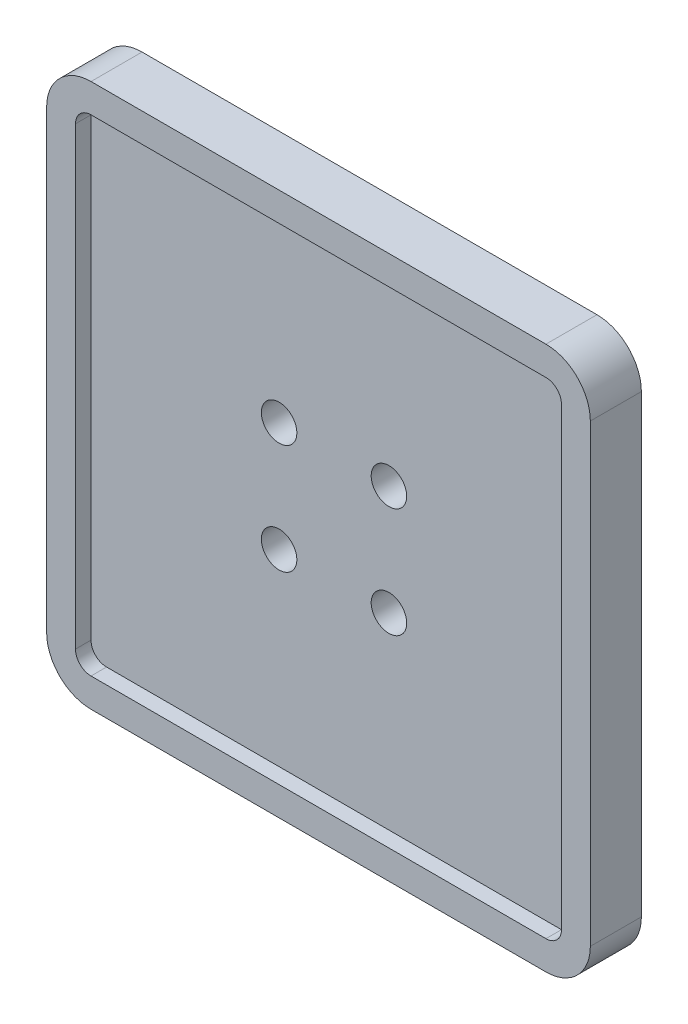
ISO-10303-21;
HEADER;
FILE_DESCRIPTION(('STEP AP214'),'2;1');
FILE_NAME('part.step','',(''),(''),'','','');
FILE_SCHEMA(('AUTOMOTIVE_DESIGN { 1 0 10303 214 1 1 1 1 }'));
ENDSEC;
DATA;
#1=APPLICATION_CONTEXT('core data for automotive mechanical design processes');
#2=APPLICATION_PROTOCOL_DEFINITION('international standard','automotive_design',2000,#1);
#3=PRODUCT_CONTEXT('',#1,'mechanical');
#4=PRODUCT('Part','Part','',(#3));
#5=PRODUCT_RELATED_PRODUCT_CATEGORY('part','',(#4));
#6=PRODUCT_DEFINITION_FORMATION('','',#4);
#7=PRODUCT_DEFINITION_CONTEXT('part definition',#1,'design');
#8=PRODUCT_DEFINITION('design','',#6,#7);
#9=PRODUCT_DEFINITION_SHAPE('','',#8);
#10=(LENGTH_UNIT() NAMED_UNIT(*) SI_UNIT(.MILLI.,.METRE.));
#11=(NAMED_UNIT(*) PLANE_ANGLE_UNIT() SI_UNIT($,.RADIAN.));
#12=(NAMED_UNIT(*) SI_UNIT($,.STERADIAN.) SOLID_ANGLE_UNIT());
#13=UNCERTAINTY_MEASURE_WITH_UNIT(LENGTH_MEASURE(1.E-05),#10,'distance_accuracy_value','');
#14=(GEOMETRIC_REPRESENTATION_CONTEXT(3) GLOBAL_UNCERTAINTY_ASSIGNED_CONTEXT((#13)) GLOBAL_UNIT_ASSIGNED_CONTEXT((#10,
#11,#12)) REPRESENTATION_CONTEXT('',''));
#15=CARTESIAN_POINT('',(0.,0.,0.));
#16=DIRECTION('',(0.,0.,1.));
#17=DIRECTION('',(1.,0.,0.));
#18=AXIS2_PLACEMENT_3D('',#15,#16,#17);
#19=CARTESIAN_POINT('',(-4.94974746830583,4.94974746830583,4.6));
#20=DIRECTION('',(0.,0.,-1.));
#21=DIRECTION('',(-1.,0.,0.));
#22=AXIS2_PLACEMENT_3D('',#19,#20,#21);
#23=CYLINDRICAL_SURFACE('',#22,1.6);
#24=CARTESIAN_POINT('',(-4.94974746830583,4.94974746830583,0.));
#25=DIRECTION('',(0.,0.,1.));
#26=DIRECTION('',(1.,0.,0.));
#27=AXIS2_PLACEMENT_3D('',#24,#25,#26);
#28=CIRCLE('',#27,1.6);
#29=CARTESIAN_POINT('',(-3.34974746830583,4.94974746830583,0.));
#30=VERTEX_POINT('',#29);
#31=EDGE_CURVE('E147',#30,#30,#28,.T.);
#32=ORIENTED_EDGE('',*,*,#31,.F.);
#33=EDGE_LOOP('',(#32));
#34=FACE_BOUND('',#33,.T.);
#35=CARTESIAN_POINT('',(-4.94974746830583,4.94974746830583,3.2));
#36=DIRECTION('',(0.,0.,1.));
#37=DIRECTION('',(1.,0.,0.));
#38=AXIS2_PLACEMENT_3D('',#35,#36,#37);
#39=CIRCLE('',#38,1.6);
#40=CARTESIAN_POINT('',(-3.34974746830583,4.94974746830583,3.2));
#41=VERTEX_POINT('',#40);
#42=EDGE_CURVE('E205',#41,#41,#39,.T.);
#43=ORIENTED_EDGE('',*,*,#42,.T.);
#44=EDGE_LOOP('',(#43));
#45=FACE_BOUND('',#44,.T.);
#46=ADVANCED_FACE('F33',(#34,#45),#23,.F.);
#47=CARTESIAN_POINT('',(4.94974746830583,4.94974746830583,4.6));
#48=DIRECTION('',(0.,0.,-1.));
#49=DIRECTION('',(-1.,0.,0.));
#50=AXIS2_PLACEMENT_3D('',#47,#48,#49);
#51=CYLINDRICAL_SURFACE('',#50,1.6);
#52=CARTESIAN_POINT('',(4.94974746830583,4.94974746830583,0.));
#53=DIRECTION('',(0.,0.,1.));
#54=DIRECTION('',(1.,0.,0.));
#55=AXIS2_PLACEMENT_3D('',#52,#53,#54);
#56=CIRCLE('',#55,1.6);
#57=CARTESIAN_POINT('',(6.54974746830583,4.94974746830583,0.));
#58=VERTEX_POINT('',#57);
#59=EDGE_CURVE('E196',#58,#58,#56,.T.);
#60=ORIENTED_EDGE('',*,*,#59,.F.);
#61=EDGE_LOOP('',(#60));
#62=FACE_BOUND('',#61,.T.);
#63=CARTESIAN_POINT('',(4.94974746830583,4.94974746830583,3.2));
#64=DIRECTION('',(0.,0.,1.));
#65=DIRECTION('',(1.,0.,0.));
#66=AXIS2_PLACEMENT_3D('',#63,#64,#65);
#67=CIRCLE('',#66,1.6);
#68=CARTESIAN_POINT('',(6.54974746830583,4.94974746830583,3.2));
#69=VERTEX_POINT('',#68);
#70=EDGE_CURVE('E208',#69,#69,#67,.T.);
#71=ORIENTED_EDGE('',*,*,#70,.T.);
#72=EDGE_LOOP('',(#71));
#73=FACE_BOUND('',#72,.T.);
#74=ADVANCED_FACE('F356',(#62,#73),#51,.F.);
#75=CARTESIAN_POINT('',(4.94974746830583,-4.94974746830583,4.6));
#76=DIRECTION('',(0.,0.,-1.));
#77=DIRECTION('',(-1.,0.,0.));
#78=AXIS2_PLACEMENT_3D('',#75,#76,#77);
#79=CYLINDRICAL_SURFACE('',#78,1.6);
#80=CARTESIAN_POINT('',(4.94974746830583,-4.94974746830583,0.));
#81=DIRECTION('',(0.,0.,1.));
#82=DIRECTION('',(1.,0.,0.));
#83=AXIS2_PLACEMENT_3D('',#80,#81,#82);
#84=CIRCLE('',#83,1.6);
#85=CARTESIAN_POINT('',(6.54974746830583,-4.94974746830583,0.));
#86=VERTEX_POINT('',#85);
#87=EDGE_CURVE('E199',#86,#86,#84,.T.);
#88=ORIENTED_EDGE('',*,*,#87,.F.);
#89=EDGE_LOOP('',(#88));
#90=FACE_BOUND('',#89,.T.);
#91=CARTESIAN_POINT('',(4.94974746830583,-4.94974746830583,3.2));
#92=DIRECTION('',(0.,0.,1.));
#93=DIRECTION('',(1.,0.,0.));
#94=AXIS2_PLACEMENT_3D('',#91,#92,#93);
#95=CIRCLE('',#94,1.6);
#96=CARTESIAN_POINT('',(6.54974746830583,-4.94974746830583,3.2));
#97=VERTEX_POINT('',#96);
#98=EDGE_CURVE('E211',#97,#97,#95,.T.);
#99=ORIENTED_EDGE('',*,*,#98,.T.);
#100=EDGE_LOOP('',(#99));
#101=FACE_BOUND('',#100,.T.);
#102=ADVANCED_FACE('F362',(#90,#101),#79,.F.);
#103=CARTESIAN_POINT('',(-4.94974746830583,-4.94974746830583,4.6));
#104=DIRECTION('',(0.,0.,-1.));
#105=DIRECTION('',(-1.,0.,0.));
#106=AXIS2_PLACEMENT_3D('',#103,#104,#105);
#107=CYLINDRICAL_SURFACE('',#106,1.6);
#108=CARTESIAN_POINT('',(-4.94974746830583,-4.94974746830583,0.));
#109=DIRECTION('',(0.,0.,1.));
#110=DIRECTION('',(1.,0.,0.));
#111=AXIS2_PLACEMENT_3D('',#108,#109,#110);
#112=CIRCLE('',#111,1.6);
#113=CARTESIAN_POINT('',(-3.34974746830583,-4.94974746830583,0.));
#114=VERTEX_POINT('',#113);
#115=EDGE_CURVE('E202',#114,#114,#112,.T.);
#116=ORIENTED_EDGE('',*,*,#115,.F.);
#117=EDGE_LOOP('',(#116));
#118=FACE_BOUND('',#117,.T.);
#119=CARTESIAN_POINT('',(-4.94974746830583,-4.94974746830583,3.2));
#120=DIRECTION('',(0.,0.,1.));
#121=DIRECTION('',(1.,0.,0.));
#122=AXIS2_PLACEMENT_3D('',#119,#120,#121);
#123=CIRCLE('',#122,1.6);
#124=CARTESIAN_POINT('',(-3.34974746830583,-4.94974746830583,3.2));
#125=VERTEX_POINT('',#124);
#126=EDGE_CURVE('E37',#125,#125,#123,.T.);
#127=ORIENTED_EDGE('',*,*,#126,.T.);
#128=EDGE_LOOP('',(#127));
#129=FACE_BOUND('',#128,.T.);
#130=ADVANCED_FACE('F371',(#118,#129),#107,.F.);
#131=CARTESIAN_POINT('',(20.5,-20.5,4.6));
#132=DIRECTION('',(0.,0.,-1.));
#133=DIRECTION('',(-1.,0.,0.));
#134=AXIS2_PLACEMENT_3D('',#131,#132,#133);
#135=PLANE('',#134);
#136=DIRECTION('',(0.,1.,0.));
#137=VECTOR('',#136,1.);
#138=CARTESIAN_POINT('',(21.9,-20.5,4.6));
#139=LINE('',#138,#137);
#140=CARTESIAN_POINT('',(21.9,-20.5,4.6));
#141=VERTEX_POINT('',#140);
#142=CARTESIAN_POINT('',(21.9,20.5,4.6));
#143=VERTEX_POINT('',#142);
#144=EDGE_CURVE('E256',#141,#143,#139,.T.);
#145=ORIENTED_EDGE('',*,*,#144,.F.);
#146=CARTESIAN_POINT('',(20.5,-20.5,4.6));
#147=DIRECTION('',(0.,0.,1.));
#148=DIRECTION('',(1.,0.,0.));
#149=AXIS2_PLACEMENT_3D('',#146,#147,#148);
#150=CIRCLE('',#149,1.39999999999998);
#151=CARTESIAN_POINT('',(20.5,-21.9,4.6));
#152=VERTEX_POINT('',#151);
#153=EDGE_CURVE('E49',#152,#141,#150,.T.);
#154=ORIENTED_EDGE('',*,*,#153,.F.);
#155=DIRECTION('',(1.,0.,0.));
#156=VECTOR('',#155,1.);
#157=CARTESIAN_POINT('',(-20.5,-21.9,4.6));
#158=LINE('',#157,#156);
#159=CARTESIAN_POINT('',(-20.5,-21.9,4.6));
#160=VERTEX_POINT('',#159);
#161=EDGE_CURVE('E237',#160,#152,#158,.T.);
#162=ORIENTED_EDGE('',*,*,#161,.F.);
#163=CARTESIAN_POINT('',(-20.5,-20.5,4.6));
#164=DIRECTION('',(0.,0.,1.));
#165=DIRECTION('',(1.,0.,0.));
#166=AXIS2_PLACEMENT_3D('',#163,#164,#165);
#167=CIRCLE('',#166,1.40000000000005);
#168=CARTESIAN_POINT('',(-21.9,-20.5,4.6));
#169=VERTEX_POINT('',#168);
#170=EDGE_CURVE('E241',#169,#160,#167,.T.);
#171=ORIENTED_EDGE('',*,*,#170,.F.);
#172=DIRECTION('',(0.,-1.,0.));
#173=VECTOR('',#172,1.);
#174=CARTESIAN_POINT('',(-21.9,20.5,4.6));
#175=LINE('',#174,#173);
#176=CARTESIAN_POINT('',(-21.9,20.5,4.6));
#177=VERTEX_POINT('',#176);
#178=EDGE_CURVE('E244',#177,#169,#175,.T.);
#179=ORIENTED_EDGE('',*,*,#178,.F.);
#180=CARTESIAN_POINT('',(-20.5,20.5,4.6));
#181=DIRECTION('',(0.,0.,1.));
#182=DIRECTION('',(1.,0.,0.));
#183=AXIS2_PLACEMENT_3D('',#180,#181,#182);
#184=CIRCLE('',#183,1.4);
#185=CARTESIAN_POINT('',(-20.5,21.9,4.6));
#186=VERTEX_POINT('',#185);
#187=EDGE_CURVE('E247',#186,#177,#184,.T.);
#188=ORIENTED_EDGE('',*,*,#187,.F.);
#189=DIRECTION('',(-1.,0.,0.));
#190=VECTOR('',#189,1.);
#191=CARTESIAN_POINT('',(20.5,21.9,4.6));
#192=LINE('',#191,#190);
#193=CARTESIAN_POINT('',(20.5,21.9,4.6));
#194=VERTEX_POINT('',#193);
#195=EDGE_CURVE('E250',#194,#186,#192,.T.);
#196=ORIENTED_EDGE('',*,*,#195,.F.);
#197=CARTESIAN_POINT('',(20.5,20.5,4.6));
#198=DIRECTION('',(0.,0.,1.));
#199=DIRECTION('',(1.,0.,0.));
#200=AXIS2_PLACEMENT_3D('',#197,#198,#199);
#201=CIRCLE('',#200,1.40000000000004);
#202=EDGE_CURVE('E253',#143,#194,#201,.T.);
#203=ORIENTED_EDGE('',*,*,#202,.F.);
#204=EDGE_LOOP('',(#145,#154,#162,#171,#179,#188,#196,#203));
#205=FACE_BOUND('',#204,.T.);
#206=CARTESIAN_POINT('',(20.5,-20.5,4.6));
#207=DIRECTION('',(0.,0.,1.));
#208=DIRECTION('',(-1.,0.,0.));
#209=AXIS2_PLACEMENT_3D('',#206,#207,#208);
#210=CIRCLE('',#209,3.99999999999998);
#211=CARTESIAN_POINT('',(20.5,-24.5,4.6));
#212=VERTEX_POINT('',#211);
#213=CARTESIAN_POINT('',(24.5,-20.5,4.6));
#214=VERTEX_POINT('',#213);
#215=EDGE_CURVE('E159',#212,#214,#210,.T.);
#216=ORIENTED_EDGE('',*,*,#215,.T.);
#217=DIRECTION('',(0.,1.,0.));
#218=VECTOR('',#217,1.);
#219=CARTESIAN_POINT('',(24.5,20.5,4.6));
#220=LINE('',#219,#218);
#221=CARTESIAN_POINT('',(24.5,20.5,4.6));
#222=VERTEX_POINT('',#221);
#223=EDGE_CURVE('E99',#214,#222,#220,.T.);
#224=ORIENTED_EDGE('',*,*,#223,.T.);
#225=CARTESIAN_POINT('',(20.5,20.5,4.6));
#226=DIRECTION('',(0.,0.,1.));
#227=DIRECTION('',(-1.,0.,0.));
#228=AXIS2_PLACEMENT_3D('',#225,#226,#227);
#229=CIRCLE('',#228,4.00000000000004);
#230=CARTESIAN_POINT('',(20.5,24.5,4.6));
#231=VERTEX_POINT('',#230);
#232=EDGE_CURVE('E175',#222,#231,#229,.T.);
#233=ORIENTED_EDGE('',*,*,#232,.T.);
#234=DIRECTION('',(-1.,0.,0.));
#235=VECTOR('',#234,1.);
#236=CARTESIAN_POINT('',(-20.5,24.5,4.6));
#237=LINE('',#236,#235);
#238=CARTESIAN_POINT('',(-20.5,24.5,4.6));
#239=VERTEX_POINT('',#238);
#240=EDGE_CURVE('E188',#231,#239,#237,.T.);
#241=ORIENTED_EDGE('',*,*,#240,.T.);
#242=CARTESIAN_POINT('',(-20.5,20.5,4.6));
#243=DIRECTION('',(0.,0.,1.));
#244=DIRECTION('',(-1.,0.,0.));
#245=AXIS2_PLACEMENT_3D('',#242,#243,#244);
#246=CIRCLE('',#245,4.);
#247=CARTESIAN_POINT('',(-24.5,20.5,4.6));
#248=VERTEX_POINT('',#247);
#249=EDGE_CURVE('E122',#239,#248,#246,.T.);
#250=ORIENTED_EDGE('',*,*,#249,.T.);
#251=DIRECTION('',(0.,-1.,0.));
#252=VECTOR('',#251,1.);
#253=CARTESIAN_POINT('',(-24.5,-20.5,4.6));
#254=LINE('',#253,#252);
#255=CARTESIAN_POINT('',(-24.5,-20.5,4.6));
#256=VERTEX_POINT('',#255);
#257=EDGE_CURVE('E115',#248,#256,#254,.T.);
#258=ORIENTED_EDGE('',*,*,#257,.T.);
#259=CARTESIAN_POINT('',(-20.5,-20.5,4.6));
#260=DIRECTION('',(0.,0.,1.));
#261=DIRECTION('',(1.,0.,0.));
#262=AXIS2_PLACEMENT_3D('',#259,#260,#261);
#263=CIRCLE('',#262,4.00000000000005);
#264=CARTESIAN_POINT('',(-20.5,-24.5,4.6));
#265=VERTEX_POINT('',#264);
#266=EDGE_CURVE('E119',#256,#265,#263,.T.);
#267=ORIENTED_EDGE('',*,*,#266,.T.);
#268=DIRECTION('',(1.,0.,0.));
#269=VECTOR('',#268,1.);
#270=CARTESIAN_POINT('',(20.5,-24.5,4.6));
#271=LINE('',#270,#269);
#272=EDGE_CURVE('E58',#265,#212,#271,.T.);
#273=ORIENTED_EDGE('',*,*,#272,.T.);
#274=EDGE_LOOP('',(#216,#224,#233,#241,#250,#258,#267,#273));
#275=FACE_BOUND('',#274,.T.);
#276=ADVANCED_FACE('F117',(#205,#275),#135,.F.);
#277=CARTESIAN_POINT('',(20.5,-20.5,0.));
#278=DIRECTION('',(0.,0.,-1.));
#279=DIRECTION('',(-1.,0.,0.));
#280=AXIS2_PLACEMENT_3D('',#277,#278,#279);
#281=PLANE('',#280);
#282=ORIENTED_EDGE('',*,*,#87,.T.);
#283=EDGE_LOOP('',(#282));
#284=FACE_BOUND('',#283,.T.);
#285=ORIENTED_EDGE('',*,*,#31,.T.);
#286=EDGE_LOOP('',(#285));
#287=FACE_BOUND('',#286,.T.);
#288=CARTESIAN_POINT('',(20.5,-20.5,0.));
#289=DIRECTION('',(0.,0.,1.));
#290=DIRECTION('',(-1.,0.,0.));
#291=AXIS2_PLACEMENT_3D('',#288,#289,#290);
#292=CIRCLE('',#291,3.99999999999998);
#293=CARTESIAN_POINT('',(20.5,-24.5,0.));
#294=VERTEX_POINT('',#293);
#295=CARTESIAN_POINT('',(24.5,-20.5,0.));
#296=VERTEX_POINT('',#295);
#297=EDGE_CURVE('E143',#294,#296,#292,.T.);
#298=ORIENTED_EDGE('',*,*,#297,.F.);
#299=DIRECTION('',(1.,0.,0.));
#300=VECTOR('',#299,1.);
#301=CARTESIAN_POINT('',(20.5,-24.5,0.));
#302=LINE('',#301,#300);
#303=CARTESIAN_POINT('',(-20.5,-24.5,0.));
#304=VERTEX_POINT('',#303);
#305=EDGE_CURVE('E91',#304,#294,#302,.T.);
#306=ORIENTED_EDGE('',*,*,#305,.F.);
#307=CARTESIAN_POINT('',(-20.5,-20.5,0.));
#308=DIRECTION('',(0.,0.,1.));
#309=DIRECTION('',(1.,0.,0.));
#310=AXIS2_PLACEMENT_3D('',#307,#308,#309);
#311=CIRCLE('',#310,4.00000000000005);
#312=CARTESIAN_POINT('',(-24.5,-20.5,0.));
#313=VERTEX_POINT('',#312);
#314=EDGE_CURVE('E156',#313,#304,#311,.T.);
#315=ORIENTED_EDGE('',*,*,#314,.F.);
#316=DIRECTION('',(0.,-1.,0.));
#317=VECTOR('',#316,1.);
#318=CARTESIAN_POINT('',(-24.5,-20.5,0.));
#319=LINE('',#318,#317);
#320=CARTESIAN_POINT('',(-24.5,20.5,0.));
#321=VERTEX_POINT('',#320);
#322=EDGE_CURVE('E131',#321,#313,#319,.T.);
#323=ORIENTED_EDGE('',*,*,#322,.F.);
#324=CARTESIAN_POINT('',(-20.5,20.5,0.));
#325=DIRECTION('',(0.,0.,1.));
#326=DIRECTION('',(-1.,0.,0.));
#327=AXIS2_PLACEMENT_3D('',#324,#325,#326);
#328=CIRCLE('',#327,4.);
#329=CARTESIAN_POINT('',(-20.5,24.5,0.));
#330=VERTEX_POINT('',#329);
#331=EDGE_CURVE('E153',#330,#321,#328,.T.);
#332=ORIENTED_EDGE('',*,*,#331,.F.);
#333=DIRECTION('',(-1.,0.,0.));
#334=VECTOR('',#333,1.);
#335=CARTESIAN_POINT('',(-20.5,24.5,0.));
#336=LINE('',#335,#334);
#337=CARTESIAN_POINT('',(20.5,24.5,0.));
#338=VERTEX_POINT('',#337);
#339=EDGE_CURVE('E151',#338,#330,#336,.T.);
#340=ORIENTED_EDGE('',*,*,#339,.F.);
#341=CARTESIAN_POINT('',(20.5,20.5,0.));
#342=DIRECTION('',(0.,0.,1.));
#343=DIRECTION('',(-1.,0.,0.));
#344=AXIS2_PLACEMENT_3D('',#341,#342,#343);
#345=CIRCLE('',#344,4.00000000000004);
#346=CARTESIAN_POINT('',(24.5,20.5,0.));
#347=VERTEX_POINT('',#346);
#348=EDGE_CURVE('E149',#347,#338,#345,.T.);
#349=ORIENTED_EDGE('',*,*,#348,.F.);
#350=DIRECTION('',(0.,1.,0.));
#351=VECTOR('',#350,1.);
#352=CARTESIAN_POINT('',(24.5,20.5,0.));
#353=LINE('',#352,#351);
#354=EDGE_CURVE('E146',#296,#347,#353,.T.);
#355=ORIENTED_EDGE('',*,*,#354,.F.);
#356=EDGE_LOOP('',(#298,#306,#315,#323,#332,#340,#349,#355));
#357=FACE_BOUND('',#356,.T.);
#358=ORIENTED_EDGE('',*,*,#59,.T.);
#359=EDGE_LOOP('',(#358));
#360=FACE_BOUND('',#359,.T.);
#361=ORIENTED_EDGE('',*,*,#115,.T.);
#362=EDGE_LOOP('',(#361));
#363=FACE_BOUND('',#362,.T.);
#364=ADVANCED_FACE('F179',(#284,#287,#357,#360,#363),#281,.T.);
#365=CARTESIAN_POINT('',(20.5,-20.5,4.6));
#366=DIRECTION('',(0.,0.,-1.));
#367=DIRECTION('',(-1.,0.,0.));
#368=AXIS2_PLACEMENT_3D('',#365,#366,#367);
#369=CYLINDRICAL_SURFACE('',#368,3.99999999999998);
#370=ORIENTED_EDGE('',*,*,#297,.T.);
#371=DIRECTION('',(0.,0.,-1.));
#372=VECTOR('',#371,1.);
#373=CARTESIAN_POINT('',(24.5,-20.5,4.6));
#374=LINE('',#373,#372);
#375=EDGE_CURVE('E11',#214,#296,#374,.T.);
#376=ORIENTED_EDGE('',*,*,#375,.F.);
#377=ORIENTED_EDGE('',*,*,#215,.F.);
#378=DIRECTION('',(0.,0.,-1.));
#379=VECTOR('',#378,1.);
#380=CARTESIAN_POINT('',(20.5,-24.5,4.6));
#381=LINE('',#380,#379);
#382=EDGE_CURVE('E139',#212,#294,#381,.T.);
#383=ORIENTED_EDGE('',*,*,#382,.T.);
#384=EDGE_LOOP('',(#370,#376,#377,#383));
#385=FACE_BOUND('',#384,.T.);
#386=ADVANCED_FACE('F35',(#385),#369,.T.);
#387=CARTESIAN_POINT('',(24.5,20.5,4.6));
#388=DIRECTION('',(-1.,0.,0.));
#389=DIRECTION('',(0.,-1.,0.));
#390=AXIS2_PLACEMENT_3D('',#387,#388,#389);
#391=PLANE('',#390);
#392=ORIENTED_EDGE('',*,*,#354,.T.);
#393=DIRECTION('',(0.,0.,-1.));
#394=VECTOR('',#393,1.);
#395=CARTESIAN_POINT('',(24.5,20.5,4.6));
#396=LINE('',#395,#394);
#397=EDGE_CURVE('E42',#222,#347,#396,.T.);
#398=ORIENTED_EDGE('',*,*,#397,.F.);
#399=ORIENTED_EDGE('',*,*,#223,.F.);
#400=ORIENTED_EDGE('',*,*,#375,.T.);
#401=EDGE_LOOP('',(#392,#398,#399,#400));
#402=FACE_BOUND('',#401,.T.);
#403=ADVANCED_FACE('F387',(#402),#391,.F.);
#404=CARTESIAN_POINT('',(20.5,20.5,4.6));
#405=DIRECTION('',(0.,0.,-1.));
#406=DIRECTION('',(-1.,0.,0.));
#407=AXIS2_PLACEMENT_3D('',#404,#405,#406);
#408=CYLINDRICAL_SURFACE('',#407,4.00000000000004);
#409=ORIENTED_EDGE('',*,*,#348,.T.);
#410=DIRECTION('',(0.,0.,-1.));
#411=VECTOR('',#410,1.);
#412=CARTESIAN_POINT('',(20.5,24.5,4.6));
#413=LINE('',#412,#411);
#414=EDGE_CURVE('E166',#231,#338,#413,.T.);
#415=ORIENTED_EDGE('',*,*,#414,.F.);
#416=ORIENTED_EDGE('',*,*,#232,.F.);
#417=ORIENTED_EDGE('',*,*,#397,.T.);
#418=EDGE_LOOP('',(#409,#415,#416,#417));
#419=FACE_BOUND('',#418,.T.);
#420=ADVANCED_FACE('F173',(#419),#408,.T.);
#421=CARTESIAN_POINT('',(-20.5,24.5,4.6));
#422=DIRECTION('',(0.,-1.,0.));
#423=DIRECTION('',(1.,0.,0.));
#424=AXIS2_PLACEMENT_3D('',#421,#422,#423);
#425=PLANE('',#424);
#426=ORIENTED_EDGE('',*,*,#339,.T.);
#427=DIRECTION('',(0.,0.,-1.));
#428=VECTOR('',#427,1.);
#429=CARTESIAN_POINT('',(-20.5,24.5,4.6));
#430=LINE('',#429,#428);
#431=EDGE_CURVE('E163',#239,#330,#430,.T.);
#432=ORIENTED_EDGE('',*,*,#431,.F.);
#433=ORIENTED_EDGE('',*,*,#240,.F.);
#434=ORIENTED_EDGE('',*,*,#414,.T.);
#435=EDGE_LOOP('',(#426,#432,#433,#434));
#436=FACE_BOUND('',#435,.T.);
#437=ADVANCED_FACE('F184',(#436),#425,.F.);
#438=CARTESIAN_POINT('',(-20.5,20.5,4.6));
#439=DIRECTION('',(0.,0.,-1.));
#440=DIRECTION('',(-1.,0.,0.));
#441=AXIS2_PLACEMENT_3D('',#438,#439,#440);
#442=CYLINDRICAL_SURFACE('',#441,4.);
#443=ORIENTED_EDGE('',*,*,#331,.T.);
#444=DIRECTION('',(0.,0.,-1.));
#445=VECTOR('',#444,1.);
#446=CARTESIAN_POINT('',(-24.5,20.5,4.6));
#447=LINE('',#446,#445);
#448=EDGE_CURVE('E134',#248,#321,#447,.T.);
#449=ORIENTED_EDGE('',*,*,#448,.F.);
#450=ORIENTED_EDGE('',*,*,#249,.F.);
#451=ORIENTED_EDGE('',*,*,#431,.T.);
#452=EDGE_LOOP('',(#443,#449,#450,#451));
#453=FACE_BOUND('',#452,.T.);
#454=ADVANCED_FACE('F187',(#453),#442,.T.);
#455=CARTESIAN_POINT('',(-24.5,-20.5,4.6));
#456=DIRECTION('',(1.,0.,0.));
#457=DIRECTION('',(0.,1.,0.));
#458=AXIS2_PLACEMENT_3D('',#455,#456,#457);
#459=PLANE('',#458);
#460=ORIENTED_EDGE('',*,*,#322,.T.);
#461=DIRECTION('',(0.,0.,-1.));
#462=VECTOR('',#461,1.);
#463=CARTESIAN_POINT('',(-24.5,-20.5,4.6));
#464=LINE('',#463,#462);
#465=EDGE_CURVE('E128',#256,#313,#464,.T.);
#466=ORIENTED_EDGE('',*,*,#465,.F.);
#467=ORIENTED_EDGE('',*,*,#257,.F.);
#468=ORIENTED_EDGE('',*,*,#448,.T.);
#469=EDGE_LOOP('',(#460,#466,#467,#468));
#470=FACE_BOUND('',#469,.T.);
#471=ADVANCED_FACE('F129',(#470),#459,.F.);
#472=CARTESIAN_POINT('',(-20.5,-20.5,4.6));
#473=DIRECTION('',(0.,0.,-1.));
#474=DIRECTION('',(-1.,0.,0.));
#475=AXIS2_PLACEMENT_3D('',#472,#473,#474);
#476=CYLINDRICAL_SURFACE('',#475,4.00000000000005);
#477=ORIENTED_EDGE('',*,*,#314,.T.);
#478=DIRECTION('',(0.,0.,-1.));
#479=VECTOR('',#478,1.);
#480=CARTESIAN_POINT('',(-20.5,-24.5,4.6));
#481=LINE('',#480,#479);
#482=EDGE_CURVE('E135',#265,#304,#481,.T.);
#483=ORIENTED_EDGE('',*,*,#482,.F.);
#484=ORIENTED_EDGE('',*,*,#266,.F.);
#485=ORIENTED_EDGE('',*,*,#465,.T.);
#486=EDGE_LOOP('',(#477,#483,#484,#485));
#487=FACE_BOUND('',#486,.T.);
#488=ADVANCED_FACE('F137',(#487),#476,.T.);
#489=CARTESIAN_POINT('',(20.5,-24.5,4.6));
#490=DIRECTION('',(0.,1.,0.));
#491=DIRECTION('',(-1.,0.,0.));
#492=AXIS2_PLACEMENT_3D('',#489,#490,#491);
#493=PLANE('',#492);
#494=ORIENTED_EDGE('',*,*,#305,.T.);
#495=ORIENTED_EDGE('',*,*,#382,.F.);
#496=ORIENTED_EDGE('',*,*,#272,.F.);
#497=ORIENTED_EDGE('',*,*,#482,.T.);
#498=EDGE_LOOP('',(#494,#495,#496,#497));
#499=FACE_BOUND('',#498,.T.);
#500=ADVANCED_FACE('F375',(#499),#493,.F.);
#501=CARTESIAN_POINT('',(20.5,-20.5,3.2));
#502=DIRECTION('',(0.,0.,1.));
#503=DIRECTION('',(1.,0.,0.));
#504=AXIS2_PLACEMENT_3D('',#501,#502,#503);
#505=CYLINDRICAL_SURFACE('',#504,1.39999999999998);
#506=ORIENTED_EDGE('',*,*,#153,.T.);
#507=DIRECTION('',(0.,0.,1.));
#508=VECTOR('',#507,1.);
#509=CARTESIAN_POINT('',(21.9,-20.5,3.2));
#510=LINE('',#509,#508);
#511=CARTESIAN_POINT('',(21.9,-20.5,3.2));
#512=VERTEX_POINT('',#511);
#513=EDGE_CURVE('E214',#512,#141,#510,.T.);
#514=ORIENTED_EDGE('',*,*,#513,.F.);
#515=CARTESIAN_POINT('',(20.5,-20.5,3.2));
#516=DIRECTION('',(0.,0.,1.));
#517=DIRECTION('',(1.,0.,0.));
#518=AXIS2_PLACEMENT_3D('',#515,#516,#517);
#519=CIRCLE('',#518,1.39999999999998);
#520=CARTESIAN_POINT('',(20.5,-21.9,3.2));
#521=VERTEX_POINT('',#520);
#522=EDGE_CURVE('E240',#521,#512,#519,.T.);
#523=ORIENTED_EDGE('',*,*,#522,.F.);
#524=DIRECTION('',(0.,0.,1.));
#525=VECTOR('',#524,1.);
#526=CARTESIAN_POINT('',(20.5,-21.9,3.2));
#527=LINE('',#526,#525);
#528=EDGE_CURVE('E235',#521,#152,#527,.T.);
#529=ORIENTED_EDGE('',*,*,#528,.T.);
#530=EDGE_LOOP('',(#506,#514,#523,#529));
#531=FACE_BOUND('',#530,.T.);
#532=ADVANCED_FACE('F289',(#531),#505,.F.);
#533=CARTESIAN_POINT('',(-20.5,-21.9,3.2));
#534=DIRECTION('',(0.,-1.,0.));
#535=DIRECTION('',(1.,0.,0.));
#536=AXIS2_PLACEMENT_3D('',#533,#534,#535);
#537=PLANE('',#536);
#538=ORIENTED_EDGE('',*,*,#161,.T.);
#539=ORIENTED_EDGE('',*,*,#528,.F.);
#540=DIRECTION('',(1.,0.,0.));
#541=VECTOR('',#540,1.);
#542=CARTESIAN_POINT('',(-20.5,-21.9,3.2));
#543=LINE('',#542,#541);
#544=CARTESIAN_POINT('',(-20.5,-21.9,3.2));
#545=VERTEX_POINT('',#544);
#546=EDGE_CURVE('E217',#545,#521,#543,.T.);
#547=ORIENTED_EDGE('',*,*,#546,.F.);
#548=DIRECTION('',(0.,0.,1.));
#549=VECTOR('',#548,1.);
#550=CARTESIAN_POINT('',(-20.5,-21.9,3.2));
#551=LINE('',#550,#549);
#552=EDGE_CURVE('E232',#545,#160,#551,.T.);
#553=ORIENTED_EDGE('',*,*,#552,.T.);
#554=EDGE_LOOP('',(#538,#539,#547,#553));
#555=FACE_BOUND('',#554,.T.);
#556=ADVANCED_FACE('F309',(#555),#537,.F.);
#557=CARTESIAN_POINT('',(-20.5,-20.5,3.2));
#558=DIRECTION('',(0.,0.,1.));
#559=DIRECTION('',(1.,0.,0.));
#560=AXIS2_PLACEMENT_3D('',#557,#558,#559);
#561=CYLINDRICAL_SURFACE('',#560,1.40000000000005);
#562=ORIENTED_EDGE('',*,*,#170,.T.);
#563=ORIENTED_EDGE('',*,*,#552,.F.);
#564=CARTESIAN_POINT('',(-20.5,-20.5,3.2));
#565=DIRECTION('',(0.,0.,1.));
#566=DIRECTION('',(1.,0.,0.));
#567=AXIS2_PLACEMENT_3D('',#564,#565,#566);
#568=CIRCLE('',#567,1.40000000000005);
#569=CARTESIAN_POINT('',(-21.9,-20.5,3.2));
#570=VERTEX_POINT('',#569);
#571=EDGE_CURVE('E262',#570,#545,#568,.T.);
#572=ORIENTED_EDGE('',*,*,#571,.F.);
#573=DIRECTION('',(0.,0.,1.));
#574=VECTOR('',#573,1.);
#575=CARTESIAN_POINT('',(-21.9,-20.5,3.2));
#576=LINE('',#575,#574);
#577=EDGE_CURVE('E229',#570,#169,#576,.T.);
#578=ORIENTED_EDGE('',*,*,#577,.T.);
#579=EDGE_LOOP('',(#562,#563,#572,#578));
#580=FACE_BOUND('',#579,.T.);
#581=ADVANCED_FACE('F314',(#580),#561,.F.);
#582=CARTESIAN_POINT('',(-21.9,20.5,3.2));
#583=DIRECTION('',(-1.,0.,0.));
#584=DIRECTION('',(0.,0.,1.));
#585=AXIS2_PLACEMENT_3D('',#582,#583,#584);
#586=PLANE('',#585);
#587=ORIENTED_EDGE('',*,*,#178,.T.);
#588=ORIENTED_EDGE('',*,*,#577,.F.);
#589=DIRECTION('',(0.,-1.,0.));
#590=VECTOR('',#589,1.);
#591=CARTESIAN_POINT('',(-21.9,20.5,3.2));
#592=LINE('',#591,#590);
#593=CARTESIAN_POINT('',(-21.9,20.5,3.2));
#594=VERTEX_POINT('',#593);
#595=EDGE_CURVE('E265',#594,#570,#592,.T.);
#596=ORIENTED_EDGE('',*,*,#595,.F.);
#597=DIRECTION('',(0.,0.,1.));
#598=VECTOR('',#597,1.);
#599=CARTESIAN_POINT('',(-21.9,20.5,3.2));
#600=LINE('',#599,#598);
#601=EDGE_CURVE('E226',#594,#177,#600,.T.);
#602=ORIENTED_EDGE('',*,*,#601,.T.);
#603=EDGE_LOOP('',(#587,#588,#596,#602));
#604=FACE_BOUND('',#603,.T.);
#605=ADVANCED_FACE('F340',(#604),#586,.F.);
#606=CARTESIAN_POINT('',(-20.5,20.5,3.2));
#607=DIRECTION('',(0.,0.,1.));
#608=DIRECTION('',(1.,0.,0.));
#609=AXIS2_PLACEMENT_3D('',#606,#607,#608);
#610=CYLINDRICAL_SURFACE('',#609,1.4);
#611=ORIENTED_EDGE('',*,*,#187,.T.);
#612=ORIENTED_EDGE('',*,*,#601,.F.);
#613=CARTESIAN_POINT('',(-20.5,20.5,3.2));
#614=DIRECTION('',(0.,0.,1.));
#615=DIRECTION('',(1.,0.,0.));
#616=AXIS2_PLACEMENT_3D('',#613,#614,#615);
#617=CIRCLE('',#616,1.4);
#618=CARTESIAN_POINT('',(-20.5,21.9,3.2));
#619=VERTEX_POINT('',#618);
#620=EDGE_CURVE('E268',#619,#594,#617,.T.);
#621=ORIENTED_EDGE('',*,*,#620,.F.);
#622=DIRECTION('',(0.,0.,1.));
#623=VECTOR('',#622,1.);
#624=CARTESIAN_POINT('',(-20.5,21.9,3.2));
#625=LINE('',#624,#623);
#626=EDGE_CURVE('E223',#619,#186,#625,.T.);
#627=ORIENTED_EDGE('',*,*,#626,.T.);
#628=EDGE_LOOP('',(#611,#612,#621,#627));
#629=FACE_BOUND('',#628,.T.);
#630=ADVANCED_FACE('F343',(#629),#610,.F.);
#631=CARTESIAN_POINT('',(20.5,21.9,3.2));
#632=DIRECTION('',(0.,1.,0.));
#633=DIRECTION('',(-1.,0.,0.));
#634=AXIS2_PLACEMENT_3D('',#631,#632,#633);
#635=PLANE('',#634);
#636=ORIENTED_EDGE('',*,*,#195,.T.);
#637=ORIENTED_EDGE('',*,*,#626,.F.);
#638=DIRECTION('',(-1.,0.,0.));
#639=VECTOR('',#638,1.);
#640=CARTESIAN_POINT('',(20.5,21.9,3.2));
#641=LINE('',#640,#639);
#642=CARTESIAN_POINT('',(20.5,21.9,3.2));
#643=VERTEX_POINT('',#642);
#644=EDGE_CURVE('E271',#643,#619,#641,.T.);
#645=ORIENTED_EDGE('',*,*,#644,.F.);
#646=DIRECTION('',(0.,0.,1.));
#647=VECTOR('',#646,1.);
#648=CARTESIAN_POINT('',(20.5,21.9,3.2));
#649=LINE('',#648,#647);
#650=EDGE_CURVE('E220',#643,#194,#649,.T.);
#651=ORIENTED_EDGE('',*,*,#650,.T.);
#652=EDGE_LOOP('',(#636,#637,#645,#651));
#653=FACE_BOUND('',#652,.T.);
#654=ADVANCED_FACE('F346',(#653),#635,.F.);
#655=CARTESIAN_POINT('',(20.5,20.5,3.2));
#656=DIRECTION('',(0.,0.,1.));
#657=DIRECTION('',(1.,0.,0.));
#658=AXIS2_PLACEMENT_3D('',#655,#656,#657);
#659=CYLINDRICAL_SURFACE('',#658,1.40000000000004);
#660=ORIENTED_EDGE('',*,*,#202,.T.);
#661=ORIENTED_EDGE('',*,*,#650,.F.);
#662=CARTESIAN_POINT('',(20.5,20.5,3.2));
#663=DIRECTION('',(0.,0.,1.));
#664=DIRECTION('',(1.,0.,0.));
#665=AXIS2_PLACEMENT_3D('',#662,#663,#664);
#666=CIRCLE('',#665,1.40000000000004);
#667=CARTESIAN_POINT('',(21.9,20.5,3.2));
#668=VERTEX_POINT('',#667);
#669=EDGE_CURVE('E274',#668,#643,#666,.T.);
#670=ORIENTED_EDGE('',*,*,#669,.F.);
#671=DIRECTION('',(0.,0.,1.));
#672=VECTOR('',#671,1.);
#673=CARTESIAN_POINT('',(21.9,20.5,3.2));
#674=LINE('',#673,#672);
#675=EDGE_CURVE('E216',#668,#143,#674,.T.);
#676=ORIENTED_EDGE('',*,*,#675,.T.);
#677=EDGE_LOOP('',(#660,#661,#670,#676));
#678=FACE_BOUND('',#677,.T.);
#679=ADVANCED_FACE('F329',(#678),#659,.F.);
#680=CARTESIAN_POINT('',(21.9,-20.5,3.2));
#681=DIRECTION('',(1.,0.,0.));
#682=DIRECTION('',(0.,1.,0.));
#683=AXIS2_PLACEMENT_3D('',#680,#681,#682);
#684=PLANE('',#683);
#685=ORIENTED_EDGE('',*,*,#144,.T.);
#686=ORIENTED_EDGE('',*,*,#675,.F.);
#687=DIRECTION('',(0.,1.,0.));
#688=VECTOR('',#687,1.);
#689=CARTESIAN_POINT('',(21.9,-20.5,3.2));
#690=LINE('',#689,#688);
#691=EDGE_CURVE('E277',#512,#668,#690,.T.);
#692=ORIENTED_EDGE('',*,*,#691,.F.);
#693=ORIENTED_EDGE('',*,*,#513,.T.);
#694=EDGE_LOOP('',(#685,#686,#692,#693));
#695=FACE_BOUND('',#694,.T.);
#696=ADVANCED_FACE('F323',(#695),#684,.F.);
#697=CARTESIAN_POINT('',(20.5,-20.5,3.2));
#698=DIRECTION('',(0.,0.,1.));
#699=DIRECTION('',(1.,0.,0.));
#700=AXIS2_PLACEMENT_3D('',#697,#698,#699);
#701=PLANE('',#700);
#702=ORIENTED_EDGE('',*,*,#42,.F.);
#703=EDGE_LOOP('',(#702));
#704=FACE_BOUND('',#703,.T.);
#705=ORIENTED_EDGE('',*,*,#70,.F.);
#706=EDGE_LOOP('',(#705));
#707=FACE_BOUND('',#706,.T.);
#708=ORIENTED_EDGE('',*,*,#98,.F.);
#709=EDGE_LOOP('',(#708));
#710=FACE_BOUND('',#709,.T.);
#711=ORIENTED_EDGE('',*,*,#126,.F.);
#712=EDGE_LOOP('',(#711));
#713=FACE_BOUND('',#712,.T.);
#714=ORIENTED_EDGE('',*,*,#522,.T.);
#715=ORIENTED_EDGE('',*,*,#691,.T.);
#716=ORIENTED_EDGE('',*,*,#669,.T.);
#717=ORIENTED_EDGE('',*,*,#644,.T.);
#718=ORIENTED_EDGE('',*,*,#620,.T.);
#719=ORIENTED_EDGE('',*,*,#595,.T.);
#720=ORIENTED_EDGE('',*,*,#571,.T.);
#721=ORIENTED_EDGE('',*,*,#546,.T.);
#722=EDGE_LOOP('',(#714,#715,#716,#717,#718,#719,#720,#721));
#723=FACE_BOUND('',#722,.T.);
#724=ADVANCED_FACE('F284',(#704,#707,#710,#713,#723),#701,.T.);
#725=CLOSED_SHELL('',(#46,#74,#102,#130,#276,#364,#386,#403,#420,#437,#454,#471,#488,#500,#532,
#556,#581,#605,#630,#654,#679,#696,#724));
#726=MANIFOLD_SOLID_BREP('B2',#725);
#727=ADVANCED_BREP_SHAPE_REPRESENTATION('',(#18,#726),#14);
#728=SHAPE_DEFINITION_REPRESENTATION(#9,#727);
ENDSEC;
END-ISO-10303-21;
